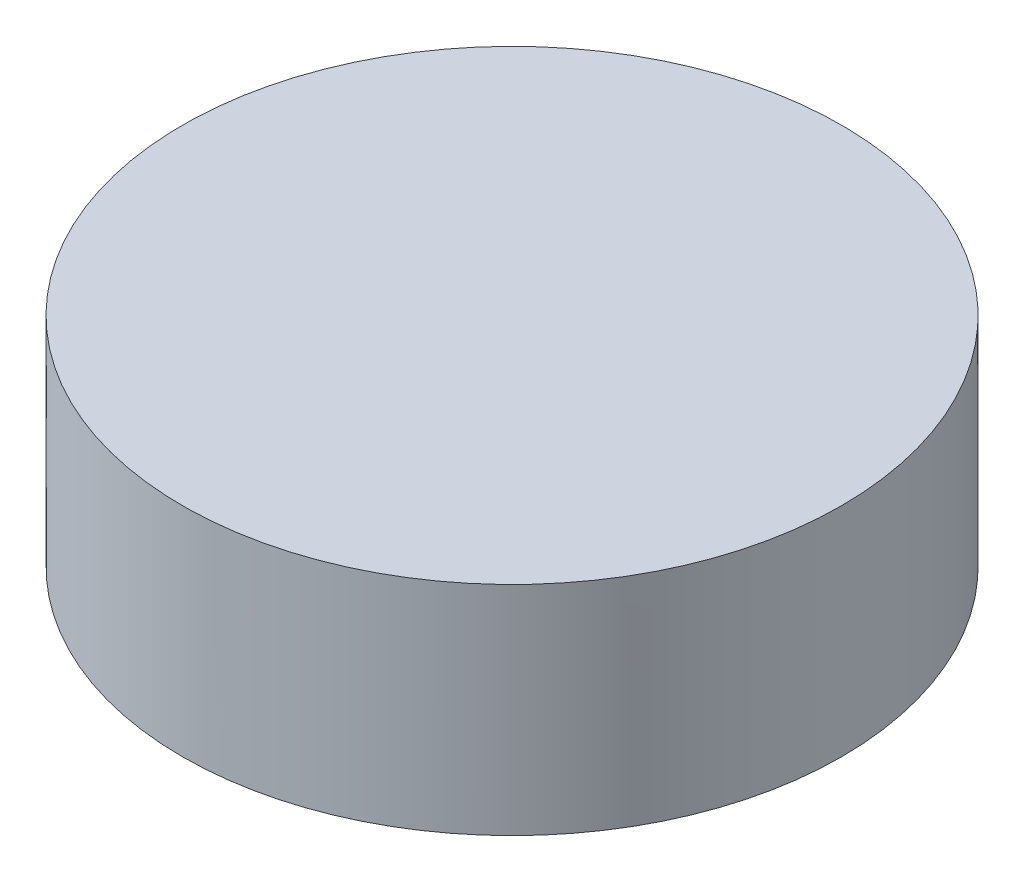
ISO-10303-21;
HEADER;
FILE_DESCRIPTION(('STEP AP214'),'2;1');
FILE_NAME('part.step','',(''),(''),'','','');
FILE_SCHEMA(('AUTOMOTIVE_DESIGN { 1 0 10303 214 1 1 1 1 }'));
ENDSEC;
DATA;
#1=APPLICATION_CONTEXT('core data for automotive mechanical design processes');
#2=APPLICATION_PROTOCOL_DEFINITION('international standard','automotive_design',2000,#1);
#3=PRODUCT_CONTEXT('',#1,'mechanical');
#4=PRODUCT('Part','Part','',(#3));
#5=PRODUCT_RELATED_PRODUCT_CATEGORY('part','',(#4));
#6=PRODUCT_DEFINITION_FORMATION('','',#4);
#7=PRODUCT_DEFINITION_CONTEXT('part definition',#1,'design');
#8=PRODUCT_DEFINITION('design','',#6,#7);
#9=PRODUCT_DEFINITION_SHAPE('','',#8);
#10=(LENGTH_UNIT() NAMED_UNIT(*) SI_UNIT(.MILLI.,.METRE.));
#11=(NAMED_UNIT(*) PLANE_ANGLE_UNIT() SI_UNIT($,.RADIAN.));
#12=(NAMED_UNIT(*) SI_UNIT($,.STERADIAN.) SOLID_ANGLE_UNIT());
#13=UNCERTAINTY_MEASURE_WITH_UNIT(LENGTH_MEASURE(1.E-05),#10,'distance_accuracy_value','');
#14=(GEOMETRIC_REPRESENTATION_CONTEXT(3) GLOBAL_UNCERTAINTY_ASSIGNED_CONTEXT((#13)) GLOBAL_UNIT_ASSIGNED_CONTEXT((#10,
#11,#12)) REPRESENTATION_CONTEXT('',''));
#15=CARTESIAN_POINT('',(0.,0.,0.));
#16=DIRECTION('',(0.,0.,1.));
#17=DIRECTION('',(1.,0.,0.));
#18=AXIS2_PLACEMENT_3D('',#15,#16,#17);
#19=CARTESIAN_POINT('',(0.,0.,0.));
#20=DIRECTION('',(0.,1.,0.));
#21=DIRECTION('',(0.,0.,1.));
#22=AXIS2_PLACEMENT_3D('',#19,#20,#21);
#23=PLANE('',#22);
#24=CARTESIAN_POINT('',(0.,0.,0.));
#25=DIRECTION('',(0.,1.,0.));
#26=DIRECTION('',(0.,0.,1.));
#27=AXIS2_PLACEMENT_3D('',#24,#25,#26);
#28=CIRCLE('',#27,15.);
#29=CARTESIAN_POINT('',(0.,0.,15.));
#30=VERTEX_POINT('',#29);
#31=EDGE_CURVE('E36',#30,#30,#28,.T.);
#32=ORIENTED_EDGE('',*,*,#31,.F.);
#33=EDGE_LOOP('',(#32));
#34=FACE_BOUND('',#33,.T.);
#35=ADVANCED_FACE('F29',(#34),#23,.F.);
#36=CARTESIAN_POINT('',(0.,52.3264068711928,0.));
#37=DIRECTION('',(0.,-1.,0.));
#38=DIRECTION('',(0.,0.,-1.));
#39=AXIS2_PLACEMENT_3D('',#36,#37,#38);
#40=CYLINDRICAL_SURFACE('',#39,15.);
#41=CARTESIAN_POINT('',(0.,9.89999999999997,0.));
#42=DIRECTION('',(0.,-1.,0.));
#43=DIRECTION('',(1.,0.,0.));
#44=AXIS2_PLACEMENT_3D('',#41,#42,#43);
#45=CIRCLE('',#44,15.);
#46=CARTESIAN_POINT('',(15.,9.89999999999998,0.));
#47=VERTEX_POINT('',#46);
#48=EDGE_CURVE('E10',#47,#47,#45,.T.);
#49=ORIENTED_EDGE('',*,*,#48,.T.);
#50=EDGE_LOOP('',(#49));
#51=FACE_BOUND('',#50,.T.);
#52=ORIENTED_EDGE('',*,*,#31,.T.);
#53=EDGE_LOOP('',(#52));
#54=FACE_BOUND('',#53,.T.);
#55=ADVANCED_FACE('F31',(#51,#54),#40,.T.);
#56=CARTESIAN_POINT('',(5.68989300120393E-13,9.89999999999997,4.5102810375397E-13));
#57=DIRECTION('',(0.,-1.,0.));
#58=DIRECTION('',(-0.510249544056269,0.,-0.860026396566042));
#59=AXIS2_PLACEMENT_3D('',#56,#57,#58);
#60=PLANE('',#59);
#61=ORIENTED_EDGE('',*,*,#48,.F.);
#62=EDGE_LOOP('',(#61));
#63=FACE_BOUND('',#62,.T.);
#64=ADVANCED_FACE('F47',(#63),#60,.F.);
#65=CLOSED_SHELL('',(#35,#55,#64));
#66=MANIFOLD_SOLID_BREP('B2',#65);
#67=ADVANCED_BREP_SHAPE_REPRESENTATION('',(#18,#66),#14);
#68=SHAPE_DEFINITION_REPRESENTATION(#9,#67);
ENDSEC;
END-ISO-10303-21;
